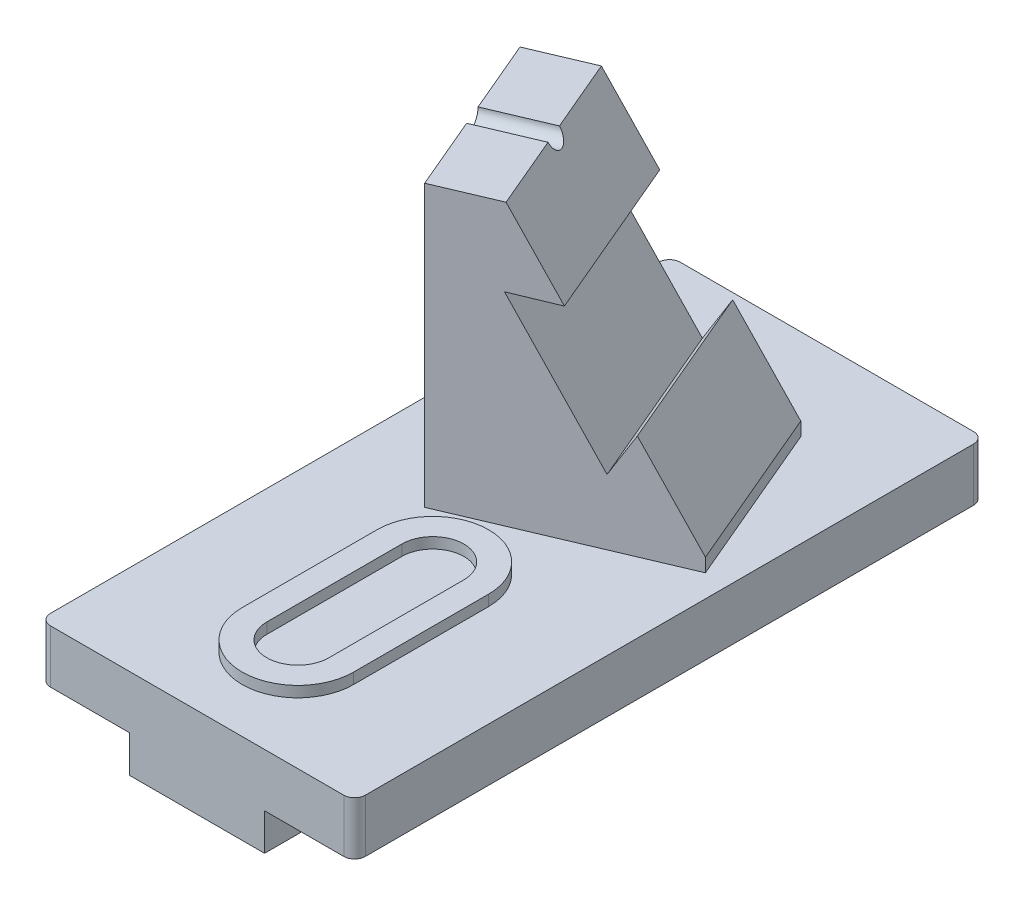
ISO-10303-21;
HEADER;
FILE_DESCRIPTION(('STEP AP214'),'2;1');
FILE_NAME('part.step','',(''),(''),'','','');
FILE_SCHEMA(('AUTOMOTIVE_DESIGN { 1 0 10303 214 1 1 1 1 }'));
ENDSEC;
DATA;
#1=APPLICATION_CONTEXT('core data for automotive mechanical design processes');
#2=APPLICATION_PROTOCOL_DEFINITION('international standard','automotive_design',2000,#1);
#3=PRODUCT_CONTEXT('',#1,'mechanical');
#4=PRODUCT('Part','Part','',(#3));
#5=PRODUCT_RELATED_PRODUCT_CATEGORY('part','',(#4));
#6=PRODUCT_DEFINITION_FORMATION('','',#4);
#7=PRODUCT_DEFINITION_CONTEXT('part definition',#1,'design');
#8=PRODUCT_DEFINITION('design','',#6,#7);
#9=PRODUCT_DEFINITION_SHAPE('','',#8);
#10=(LENGTH_UNIT() NAMED_UNIT(*) SI_UNIT(.MILLI.,.METRE.));
#11=(NAMED_UNIT(*) PLANE_ANGLE_UNIT() SI_UNIT($,.RADIAN.));
#12=(NAMED_UNIT(*) SI_UNIT($,.STERADIAN.) SOLID_ANGLE_UNIT());
#13=UNCERTAINTY_MEASURE_WITH_UNIT(LENGTH_MEASURE(1.E-05),#10,'distance_accuracy_value','');
#14=(GEOMETRIC_REPRESENTATION_CONTEXT(3) GLOBAL_UNCERTAINTY_ASSIGNED_CONTEXT((#13)) GLOBAL_UNIT_ASSIGNED_CONTEXT((#10,
#11,#12)) REPRESENTATION_CONTEXT('',''));
#15=CARTESIAN_POINT('',(0.,0.,0.));
#16=DIRECTION('',(0.,0.,1.));
#17=DIRECTION('',(1.,0.,0.));
#18=AXIS2_PLACEMENT_3D('',#15,#16,#17);
#19=CARTESIAN_POINT('',(-147.226380819536,312.,193.89303788996));
#20=DIRECTION('',(0.,-1.,0.));
#21=DIRECTION('',(1.,0.,0.));
#22=AXIS2_PLACEMENT_3D('',#19,#20,#21);
#23=PLANE('',#22);
#24=DIRECTION('',(0.92050485345244,0.,-0.390731128489275));
#25=VECTOR('',#24,1.);
#26=CARTESIAN_POINT('',(-1191.60011822053,312.,758.87575039678));
#27=LINE('',#26,#25);
#28=CARTESIAN_POINT('',(-103.464494428737,312.000000000001,296.989581476633));
#29=VERTEX_POINT('',#28);
#30=CARTESIAN_POINT('',(-39.9496595405185,312.,270.029133610873));
#31=VERTEX_POINT('',#30);
#32=EDGE_CURVE('E48',#29,#31,#27,.T.);
#33=ORIENTED_EDGE('',*,*,#32,.F.);
#34=DIRECTION('',(0.390731128489275,0.,0.92050485345244));
#35=VECTOR('',#34,1.);
#36=CARTESIAN_POINT('',(-147.226380819536,312.,193.89303788996));
#37=LINE('',#36,#35);
#38=CARTESIAN_POINT('',(-69.0801551216807,312.,377.994008580448));
#39=VERTEX_POINT('',#38);
#40=EDGE_CURVE('E245',#29,#39,#37,.T.);
#41=ORIENTED_EDGE('',*,*,#40,.T.);
#42=DIRECTION('',(0.92050485345244,0.,-0.390731128489275));
#43=VECTOR('',#42,1.);
#44=CARTESIAN_POINT('',(-69.0801551216807,312.,377.994008580448));
#45=LINE('',#44,#43);
#46=CARTESIAN_POINT('',(-5.56532023346235,312.,351.033560714688));
#47=VERTEX_POINT('',#46);
#48=EDGE_CURVE('E287',#39,#47,#45,.T.);
#49=ORIENTED_EDGE('',*,*,#48,.T.);
#50=DIRECTION('',(0.390731128489275,0.,0.92050485345244));
#51=VECTOR('',#50,1.);
#52=CARTESIAN_POINT('',(-83.7115459313173,312.,166.9325900242));
#53=LINE('',#52,#51);
#54=EDGE_CURVE('E246',#31,#47,#53,.T.);
#55=ORIENTED_EDGE('',*,*,#54,.F.);
#56=EDGE_LOOP('',(#33,#41,#49,#55));
#57=FACE_BOUND('',#56,.T.);
#58=ADVANCED_FACE('F33',(#57),#23,.F.);
#59=CARTESIAN_POINT('',(-175.,0.,700.));
#60=DIRECTION('',(0.,-1.,0.));
#61=DIRECTION('',(0.,0.,-1.));
#62=AXIS2_PLACEMENT_3D('',#59,#60,#61);
#63=PLANE('',#62);
#64=DIRECTION('',(0.390731128489275,0.,0.92050485345244));
#65=VECTOR('',#64,1.);
#66=CARTESIAN_POINT('',(-147.226380819536,0.,193.89303788996));
#67=LINE('',#66,#65);
#68=CARTESIAN_POINT('',(-147.226380819536,0.,193.89303788996));
#69=VERTEX_POINT('',#68);
#70=CARTESIAN_POINT('',(-69.0801551216807,0.,377.994008580448));
#71=VERTEX_POINT('',#70);
#72=EDGE_CURVE('E314',#69,#71,#67,.T.);
#73=ORIENTED_EDGE('',*,*,#72,.F.);
#74=DIRECTION('',(-0.92050485345244,0.,0.390731128489275));
#75=VECTOR('',#74,1.);
#76=CARTESIAN_POINT('',(71.853774302145,0.,100.899029309512));
#77=LINE('',#76,#75);
#78=CARTESIAN_POINT('',(71.853774302145,0.,100.899029309512));
#79=VERTEX_POINT('',#78);
#80=EDGE_CURVE('E262',#79,#69,#77,.T.);
#81=ORIENTED_EDGE('',*,*,#80,.F.);
#82=DIRECTION('',(0.390731128489275,0.,0.92050485345244));
#83=VECTOR('',#82,1.);
#84=CARTESIAN_POINT('',(71.853774302145,0.,100.899029309512));
#85=LINE('',#84,#83);
#86=CARTESIAN_POINT('',(150.,0.,285.));
#87=VERTEX_POINT('',#86);
#88=EDGE_CURVE('E317',#79,#87,#85,.T.);
#89=ORIENTED_EDGE('',*,*,#88,.T.);
#90=DIRECTION('',(-0.92050485345244,0.,0.390731128489275));
#91=VECTOR('',#90,1.);
#92=CARTESIAN_POINT('',(150.,0.,285.));
#93=LINE('',#92,#91);
#94=EDGE_CURVE('E282',#87,#71,#93,.T.);
#95=ORIENTED_EDGE('',*,*,#94,.T.);
#96=EDGE_LOOP('',(#73,#81,#89,#95));
#97=FACE_BOUND('',#96,.T.);
#98=DIRECTION('',(-1.,0.,0.));
#99=VECTOR('',#98,1.);
#100=CARTESIAN_POINT('',(-175.,0.,0.));
#101=LINE('',#100,#99);
#102=CARTESIAN_POINT('',(163.,0.,0.));
#103=VERTEX_POINT('',#102);
#104=CARTESIAN_POINT('',(-163.,0.,0.));
#105=VERTEX_POINT('',#104);
#106=EDGE_CURVE('E386',#103,#105,#101,.T.);
#107=ORIENTED_EDGE('',*,*,#106,.T.);
#108=CARTESIAN_POINT('',(-163.,0.,12.));
#109=DIRECTION('',(0.,-1.,0.));
#110=DIRECTION('',(0.,0.,-1.));
#111=AXIS2_PLACEMENT_3D('',#108,#109,#110);
#112=CIRCLE('',#111,12.);
#113=CARTESIAN_POINT('',(-175.,0.,12.));
#114=VERTEX_POINT('',#113);
#115=EDGE_CURVE('E453',#105,#114,#112,.F.);
#116=ORIENTED_EDGE('',*,*,#115,.T.);
#117=DIRECTION('',(0.,0.,-1.));
#118=VECTOR('',#117,1.);
#119=CARTESIAN_POINT('',(-175.,0.,700.));
#120=LINE('',#119,#118);
#121=CARTESIAN_POINT('',(-175.,0.,688.));
#122=VERTEX_POINT('',#121);
#123=EDGE_CURVE('E398',#122,#114,#120,.T.);
#124=ORIENTED_EDGE('',*,*,#123,.F.);
#125=CARTESIAN_POINT('',(-163.,0.,688.));
#126=DIRECTION('',(0.,-1.,0.));
#127=DIRECTION('',(0.,0.,-1.));
#128=AXIS2_PLACEMENT_3D('',#125,#126,#127);
#129=CIRCLE('',#128,12.);
#130=CARTESIAN_POINT('',(-163.,0.,700.));
#131=VERTEX_POINT('',#130);
#132=EDGE_CURVE('E447',#122,#131,#129,.F.);
#133=ORIENTED_EDGE('',*,*,#132,.T.);
#134=DIRECTION('',(-1.,0.,0.));
#135=VECTOR('',#134,1.);
#136=CARTESIAN_POINT('',(-175.,0.,700.));
#137=LINE('',#136,#135);
#138=CARTESIAN_POINT('',(163.,0.,700.));
#139=VERTEX_POINT('',#138);
#140=EDGE_CURVE('E395',#139,#131,#137,.T.);
#141=ORIENTED_EDGE('',*,*,#140,.F.);
#142=CARTESIAN_POINT('',(163.,0.,688.));
#143=DIRECTION('',(0.,-1.,0.));
#144=DIRECTION('',(0.,0.,-1.));
#145=AXIS2_PLACEMENT_3D('',#142,#143,#144);
#146=CIRCLE('',#145,12.);
#147=CARTESIAN_POINT('',(175.,0.,688.));
#148=VERTEX_POINT('',#147);
#149=EDGE_CURVE('E449',#139,#148,#146,.F.);
#150=ORIENTED_EDGE('',*,*,#149,.T.);
#151=DIRECTION('',(0.,0.,-1.));
#152=VECTOR('',#151,1.);
#153=CARTESIAN_POINT('',(175.,0.,700.));
#154=LINE('',#153,#152);
#155=CARTESIAN_POINT('',(175.,0.,12.));
#156=VERTEX_POINT('',#155);
#157=EDGE_CURVE('E413',#148,#156,#154,.T.);
#158=ORIENTED_EDGE('',*,*,#157,.T.);
#159=CARTESIAN_POINT('',(163.,0.,12.));
#160=DIRECTION('',(0.,-1.,0.));
#161=DIRECTION('',(0.,0.,-1.));
#162=AXIS2_PLACEMENT_3D('',#159,#160,#161);
#163=CIRCLE('',#162,12.);
#164=EDGE_CURVE('E451',#156,#103,#163,.F.);
#165=ORIENTED_EDGE('',*,*,#164,.T.);
#166=EDGE_LOOP('',(#107,#116,#124,#133,#141,#150,#158,#165));
#167=FACE_BOUND('',#166,.T.);
#168=CARTESIAN_POINT('',(-1.54344196692571E-13,0.,588.));
#169=DIRECTION('',(0.,1.,0.));
#170=DIRECTION('',(0.,0.,1.));
#171=AXIS2_PLACEMENT_3D('',#168,#169,#170);
#172=CIRCLE('',#171,62.);
#173=CARTESIAN_POINT('',(-62.0000000000001,0.,588.));
#174=VERTEX_POINT('',#173);
#175=CARTESIAN_POINT('',(61.9999999999998,0.,588.));
#176=VERTEX_POINT('',#175);
#177=EDGE_CURVE('E349',#174,#176,#172,.T.);
#178=ORIENTED_EDGE('',*,*,#177,.F.);
#179=DIRECTION('',(0.,0.,1.));
#180=VECTOR('',#179,1.);
#181=CARTESIAN_POINT('',(-62.0000000000001,0.,588.));
#182=LINE('',#181,#180);
#183=CARTESIAN_POINT('',(-62.0000000000001,0.,438.));
#184=VERTEX_POINT('',#183);
#185=EDGE_CURVE('E354',#184,#174,#182,.T.);
#186=ORIENTED_EDGE('',*,*,#185,.F.);
#187=CARTESIAN_POINT('',(1.1760479271815E-13,0.,438.));
#188=DIRECTION('',(0.,1.,0.));
#189=DIRECTION('',(0.,0.,1.));
#190=AXIS2_PLACEMENT_3D('',#187,#188,#189);
#191=CIRCLE('',#190,62.0000000000001);
#192=CARTESIAN_POINT('',(62.0000000000002,0.,438.));
#193=VERTEX_POINT('',#192);
#194=EDGE_CURVE('E366',#193,#184,#191,.T.);
#195=ORIENTED_EDGE('',*,*,#194,.F.);
#196=DIRECTION('',(0.,0.,-1.));
#197=VECTOR('',#196,1.);
#198=CARTESIAN_POINT('',(61.9999999999998,0.,588.));
#199=LINE('',#198,#197);
#200=EDGE_CURVE('E363',#176,#193,#199,.T.);
#201=ORIENTED_EDGE('',*,*,#200,.F.);
#202=EDGE_LOOP('',(#178,#186,#195,#201));
#203=FACE_BOUND('',#202,.T.);
#204=ADVANCED_FACE('F476',(#97,#167,#203),#63,.F.);
#205=CARTESIAN_POINT('',(-175.,-59.,700.));
#206=DIRECTION('',(1.,0.,0.));
#207=DIRECTION('',(0.,0.,-1.));
#208=AXIS2_PLACEMENT_3D('',#205,#206,#207);
#209=PLANE('',#208);
#210=ORIENTED_EDGE('',*,*,#123,.T.);
#211=DIRECTION('',(0.,-1.,0.));
#212=VECTOR('',#211,1.);
#213=CARTESIAN_POINT('',(-175.,-59.,12.));
#214=LINE('',#213,#212);
#215=CARTESIAN_POINT('',(-175.,-59.,12.));
#216=VERTEX_POINT('',#215);
#217=EDGE_CURVE('E436',#114,#216,#214,.T.);
#218=ORIENTED_EDGE('',*,*,#217,.T.);
#219=DIRECTION('',(0.,0.,-1.));
#220=VECTOR('',#219,1.);
#221=CARTESIAN_POINT('',(-175.,-59.,700.));
#222=LINE('',#221,#220);
#223=CARTESIAN_POINT('',(-175.,-59.,688.));
#224=VERTEX_POINT('',#223);
#225=EDGE_CURVE('E431',#224,#216,#222,.T.);
#226=ORIENTED_EDGE('',*,*,#225,.F.);
#227=DIRECTION('',(0.,-1.,0.));
#228=VECTOR('',#227,1.);
#229=CARTESIAN_POINT('',(-175.,-59.,688.));
#230=LINE('',#229,#228);
#231=EDGE_CURVE('E434',#224,#122,#230,.F.);
#232=ORIENTED_EDGE('',*,*,#231,.T.);
#233=EDGE_LOOP('',(#210,#218,#226,#232));
#234=FACE_BOUND('',#233,.T.);
#235=ADVANCED_FACE('F526',(#234),#209,.F.);
#236=CARTESIAN_POINT('',(-75.,-59.,700.));
#237=DIRECTION('',(0.,1.,0.));
#238=DIRECTION('',(-1.,0.,0.));
#239=AXIS2_PLACEMENT_3D('',#236,#237,#238);
#240=PLANE('',#239);
#241=ORIENTED_EDGE('',*,*,#225,.T.);
#242=CARTESIAN_POINT('',(-163.,-59.,12.));
#243=DIRECTION('',(0.,1.,0.));
#244=DIRECTION('',(-1.,0.,0.));
#245=AXIS2_PLACEMENT_3D('',#242,#243,#244);
#246=CIRCLE('',#245,12.);
#247=CARTESIAN_POINT('',(-163.,-59.,0.));
#248=VERTEX_POINT('',#247);
#249=EDGE_CURVE('E441',#216,#248,#246,.F.);
#250=ORIENTED_EDGE('',*,*,#249,.T.);
#251=DIRECTION('',(1.,0.,0.));
#252=VECTOR('',#251,1.);
#253=CARTESIAN_POINT('',(-75.,-59.,0.));
#254=LINE('',#253,#252);
#255=CARTESIAN_POINT('',(-75.,-59.,0.));
#256=VERTEX_POINT('',#255);
#257=EDGE_CURVE('E382',#248,#256,#254,.T.);
#258=ORIENTED_EDGE('',*,*,#257,.T.);
#259=DIRECTION('',(0.,0.,-1.));
#260=VECTOR('',#259,1.);
#261=CARTESIAN_POINT('',(-75.,-59.,700.));
#262=LINE('',#261,#260);
#263=CARTESIAN_POINT('',(-75.,-59.,700.));
#264=VERTEX_POINT('',#263);
#265=EDGE_CURVE('E428',#264,#256,#262,.T.);
#266=ORIENTED_EDGE('',*,*,#265,.F.);
#267=DIRECTION('',(1.,0.,0.));
#268=VECTOR('',#267,1.);
#269=CARTESIAN_POINT('',(-75.,-59.,700.));
#270=LINE('',#269,#268);
#271=CARTESIAN_POINT('',(-163.,-59.,700.));
#272=VERTEX_POINT('',#271);
#273=EDGE_CURVE('E383',#272,#264,#270,.T.);
#274=ORIENTED_EDGE('',*,*,#273,.F.);
#275=CARTESIAN_POINT('',(-163.,-59.,688.));
#276=DIRECTION('',(0.,1.,0.));
#277=DIRECTION('',(-1.,0.,0.));
#278=AXIS2_PLACEMENT_3D('',#275,#276,#277);
#279=CIRCLE('',#278,12.);
#280=EDGE_CURVE('E439',#272,#224,#279,.F.);
#281=ORIENTED_EDGE('',*,*,#280,.T.);
#282=EDGE_LOOP('',(#241,#250,#258,#266,#274,#281));
#283=FACE_BOUND('',#282,.T.);
#284=ADVANCED_FACE('F486',(#283),#240,.F.);
#285=CARTESIAN_POINT('',(-75.,-100.,700.));
#286=DIRECTION('',(1.,0.,0.));
#287=DIRECTION('',(0.,0.,-1.));
#288=AXIS2_PLACEMENT_3D('',#285,#286,#287);
#289=PLANE('',#288);
#290=DIRECTION('',(0.,-1.,0.));
#291=VECTOR('',#290,1.);
#292=CARTESIAN_POINT('',(-75.,-100.,0.));
#293=LINE('',#292,#291);
#294=CARTESIAN_POINT('',(-75.,-100.,0.));
#295=VERTEX_POINT('',#294);
#296=EDGE_CURVE('E400',#256,#295,#293,.T.);
#297=ORIENTED_EDGE('',*,*,#296,.T.);
#298=DIRECTION('',(0.,0.,-1.));
#299=VECTOR('',#298,1.);
#300=CARTESIAN_POINT('',(-75.,-100.,700.));
#301=LINE('',#300,#299);
#302=CARTESIAN_POINT('',(-75.,-100.,700.));
#303=VERTEX_POINT('',#302);
#304=EDGE_CURVE('E425',#303,#295,#301,.T.);
#305=ORIENTED_EDGE('',*,*,#304,.F.);
#306=DIRECTION('',(0.,-1.,0.));
#307=VECTOR('',#306,1.);
#308=CARTESIAN_POINT('',(-75.,-100.,700.));
#309=LINE('',#308,#307);
#310=EDGE_CURVE('E385',#264,#303,#309,.T.);
#311=ORIENTED_EDGE('',*,*,#310,.F.);
#312=ORIENTED_EDGE('',*,*,#265,.T.);
#313=EDGE_LOOP('',(#297,#305,#311,#312));
#314=FACE_BOUND('',#313,.T.);
#315=ADVANCED_FACE('F493',(#314),#289,.F.);
#316=CARTESIAN_POINT('',(75.,-100.,700.));
#317=DIRECTION('',(0.,1.,0.));
#318=DIRECTION('',(0.,0.,1.));
#319=AXIS2_PLACEMENT_3D('',#316,#317,#318);
#320=PLANE('',#319);
#321=DIRECTION('',(1.,0.,0.));
#322=VECTOR('',#321,1.);
#323=CARTESIAN_POINT('',(75.,-100.,0.));
#324=LINE('',#323,#322);
#325=CARTESIAN_POINT('',(75.,-100.,0.));
#326=VERTEX_POINT('',#325);
#327=EDGE_CURVE('E402',#295,#326,#324,.T.);
#328=ORIENTED_EDGE('',*,*,#327,.T.);
#329=DIRECTION('',(0.,0.,-1.));
#330=VECTOR('',#329,1.);
#331=CARTESIAN_POINT('',(75.,-100.,700.));
#332=LINE('',#331,#330);
#333=CARTESIAN_POINT('',(75.,-100.,700.));
#334=VERTEX_POINT('',#333);
#335=EDGE_CURVE('E422',#334,#326,#332,.T.);
#336=ORIENTED_EDGE('',*,*,#335,.F.);
#337=DIRECTION('',(1.,0.,0.));
#338=VECTOR('',#337,1.);
#339=CARTESIAN_POINT('',(75.,-100.,700.));
#340=LINE('',#339,#338);
#341=EDGE_CURVE('E388',#303,#334,#340,.T.);
#342=ORIENTED_EDGE('',*,*,#341,.F.);
#343=ORIENTED_EDGE('',*,*,#304,.T.);
#344=EDGE_LOOP('',(#328,#336,#342,#343));
#345=FACE_BOUND('',#344,.T.);
#346=ADVANCED_FACE('F499',(#345),#320,.F.);
#347=CARTESIAN_POINT('',(75.,-59.,700.));
#348=DIRECTION('',(-1.,0.,0.));
#349=DIRECTION('',(0.,0.,1.));
#350=AXIS2_PLACEMENT_3D('',#347,#348,#349);
#351=PLANE('',#350);
#352=DIRECTION('',(0.,1.,0.));
#353=VECTOR('',#352,1.);
#354=CARTESIAN_POINT('',(75.,-59.,0.));
#355=LINE('',#354,#353);
#356=CARTESIAN_POINT('',(75.,-59.,0.));
#357=VERTEX_POINT('',#356);
#358=EDGE_CURVE('E404',#326,#357,#355,.T.);
#359=ORIENTED_EDGE('',*,*,#358,.T.);
#360=DIRECTION('',(0.,0.,-1.));
#361=VECTOR('',#360,1.);
#362=CARTESIAN_POINT('',(75.,-59.,700.));
#363=LINE('',#362,#361);
#364=CARTESIAN_POINT('',(75.,-59.,700.));
#365=VERTEX_POINT('',#364);
#366=EDGE_CURVE('E419',#365,#357,#363,.T.);
#367=ORIENTED_EDGE('',*,*,#366,.F.);
#368=DIRECTION('',(0.,1.,0.));
#369=VECTOR('',#368,1.);
#370=CARTESIAN_POINT('',(75.,-59.,700.));
#371=LINE('',#370,#369);
#372=EDGE_CURVE('E390',#334,#365,#371,.T.);
#373=ORIENTED_EDGE('',*,*,#372,.F.);
#374=ORIENTED_EDGE('',*,*,#335,.T.);
#375=EDGE_LOOP('',(#359,#367,#373,#374));
#376=FACE_BOUND('',#375,.T.);
#377=ADVANCED_FACE('F503',(#376),#351,.F.);
#378=CARTESIAN_POINT('',(175.,-59.,700.));
#379=DIRECTION('',(0.,1.,0.));
#380=DIRECTION('',(-1.,0.,0.));
#381=AXIS2_PLACEMENT_3D('',#378,#379,#380);
#382=PLANE('',#381);
#383=DIRECTION('',(1.,0.,0.));
#384=VECTOR('',#383,1.);
#385=CARTESIAN_POINT('',(175.,-59.,0.));
#386=LINE('',#385,#384);
#387=CARTESIAN_POINT('',(163.,-59.,0.));
#388=VERTEX_POINT('',#387);
#389=EDGE_CURVE('E406',#357,#388,#386,.T.);
#390=ORIENTED_EDGE('',*,*,#389,.T.);
#391=CARTESIAN_POINT('',(163.,-59.,12.));
#392=DIRECTION('',(0.,1.,0.));
#393=DIRECTION('',(-1.,0.,0.));
#394=AXIS2_PLACEMENT_3D('',#391,#392,#393);
#395=CIRCLE('',#394,12.);
#396=CARTESIAN_POINT('',(175.,-59.,12.));
#397=VERTEX_POINT('',#396);
#398=EDGE_CURVE('E462',#388,#397,#395,.F.);
#399=ORIENTED_EDGE('',*,*,#398,.T.);
#400=DIRECTION('',(0.,0.,-1.));
#401=VECTOR('',#400,1.);
#402=CARTESIAN_POINT('',(175.,-59.,700.));
#403=LINE('',#402,#401);
#404=CARTESIAN_POINT('',(175.,-59.,688.));
#405=VERTEX_POINT('',#404);
#406=EDGE_CURVE('E416',#405,#397,#403,.T.);
#407=ORIENTED_EDGE('',*,*,#406,.F.);
#408=CARTESIAN_POINT('',(163.,-59.,688.));
#409=DIRECTION('',(0.,1.,0.));
#410=DIRECTION('',(-1.,0.,0.));
#411=AXIS2_PLACEMENT_3D('',#408,#409,#410);
#412=CIRCLE('',#411,12.);
#413=CARTESIAN_POINT('',(163.,-59.,700.));
#414=VERTEX_POINT('',#413);
#415=EDGE_CURVE('E460',#405,#414,#412,.F.);
#416=ORIENTED_EDGE('',*,*,#415,.T.);
#417=DIRECTION('',(1.,0.,0.));
#418=VECTOR('',#417,1.);
#419=CARTESIAN_POINT('',(175.,-59.,700.));
#420=LINE('',#419,#418);
#421=EDGE_CURVE('E392',#365,#414,#420,.T.);
#422=ORIENTED_EDGE('',*,*,#421,.F.);
#423=ORIENTED_EDGE('',*,*,#366,.T.);
#424=EDGE_LOOP('',(#390,#399,#407,#416,#422,#423));
#425=FACE_BOUND('',#424,.T.);
#426=ADVANCED_FACE('F506',(#425),#382,.F.);
#427=CARTESIAN_POINT('',(175.,0.,700.));
#428=DIRECTION('',(-1.,0.,0.));
#429=DIRECTION('',(0.,0.,1.));
#430=AXIS2_PLACEMENT_3D('',#427,#428,#429);
#431=PLANE('',#430);
#432=ORIENTED_EDGE('',*,*,#406,.T.);
#433=DIRECTION('',(0.,1.,0.));
#434=VECTOR('',#433,1.);
#435=CARTESIAN_POINT('',(175.,0.,12.));
#436=LINE('',#435,#434);
#437=EDGE_CURVE('E457',#397,#156,#436,.T.);
#438=ORIENTED_EDGE('',*,*,#437,.T.);
#439=ORIENTED_EDGE('',*,*,#157,.F.);
#440=DIRECTION('',(0.,1.,0.));
#441=VECTOR('',#440,1.);
#442=CARTESIAN_POINT('',(175.,0.,688.));
#443=LINE('',#442,#441);
#444=EDGE_CURVE('E455',#148,#405,#443,.F.);
#445=ORIENTED_EDGE('',*,*,#444,.T.);
#446=EDGE_LOOP('',(#432,#438,#439,#445));
#447=FACE_BOUND('',#446,.T.);
#448=ADVANCED_FACE('F511',(#447),#431,.F.);
#449=CARTESIAN_POINT('',(0.,0.,700.));
#450=DIRECTION('',(0.,0.,-1.));
#451=DIRECTION('',(-1.,0.,0.));
#452=AXIS2_PLACEMENT_3D('',#449,#450,#451);
#453=PLANE('',#452);
#454=ORIENTED_EDGE('',*,*,#421,.T.);
#455=DIRECTION('',(0.,1.,0.));
#456=VECTOR('',#455,1.);
#457=CARTESIAN_POINT('',(163.,0.,700.));
#458=LINE('',#457,#456);
#459=EDGE_CURVE('E41',#414,#139,#458,.T.);
#460=ORIENTED_EDGE('',*,*,#459,.T.);
#461=ORIENTED_EDGE('',*,*,#140,.T.);
#462=DIRECTION('',(0.,-1.,0.));
#463=VECTOR('',#462,1.);
#464=CARTESIAN_POINT('',(-163.,0.,700.));
#465=LINE('',#464,#463);
#466=EDGE_CURVE('E464',#131,#272,#465,.T.);
#467=ORIENTED_EDGE('',*,*,#466,.T.);
#468=ORIENTED_EDGE('',*,*,#273,.T.);
#469=ORIENTED_EDGE('',*,*,#310,.T.);
#470=ORIENTED_EDGE('',*,*,#341,.T.);
#471=ORIENTED_EDGE('',*,*,#372,.T.);
#472=EDGE_LOOP('',(#454,#460,#461,#467,#468,#469,#470,#471));
#473=FACE_BOUND('',#472,.T.);
#474=ADVANCED_FACE('F470',(#473),#453,.F.);
#475=CARTESIAN_POINT('',(0.,0.,0.));
#476=DIRECTION('',(0.,0.,-1.));
#477=DIRECTION('',(-1.,0.,0.));
#478=AXIS2_PLACEMENT_3D('',#475,#476,#477);
#479=PLANE('',#478);
#480=ORIENTED_EDGE('',*,*,#257,.F.);
#481=DIRECTION('',(0.,-1.,0.));
#482=VECTOR('',#481,1.);
#483=CARTESIAN_POINT('',(-163.,0.,0.));
#484=LINE('',#483,#482);
#485=EDGE_CURVE('E445',#248,#105,#484,.F.);
#486=ORIENTED_EDGE('',*,*,#485,.T.);
#487=ORIENTED_EDGE('',*,*,#106,.F.);
#488=DIRECTION('',(0.,1.,0.));
#489=VECTOR('',#488,1.);
#490=CARTESIAN_POINT('',(163.,-59.,0.));
#491=LINE('',#490,#489);
#492=EDGE_CURVE('E443',#103,#388,#491,.F.);
#493=ORIENTED_EDGE('',*,*,#492,.T.);
#494=ORIENTED_EDGE('',*,*,#389,.F.);
#495=ORIENTED_EDGE('',*,*,#358,.F.);
#496=ORIENTED_EDGE('',*,*,#327,.F.);
#497=ORIENTED_EDGE('',*,*,#296,.F.);
#498=EDGE_LOOP('',(#480,#486,#487,#493,#494,#495,#496,#497));
#499=FACE_BOUND('',#498,.T.);
#500=ADVANCED_FACE('F518',(#499),#479,.T.);
#501=CARTESIAN_POINT('',(-163.,-59.,12.));
#502=DIRECTION('',(0.,1.,0.));
#503=DIRECTION('',(0.,0.,1.));
#504=AXIS2_PLACEMENT_3D('',#501,#502,#503);
#505=CYLINDRICAL_SURFACE('',#504,12.);
#506=ORIENTED_EDGE('',*,*,#115,.F.);
#507=ORIENTED_EDGE('',*,*,#485,.F.);
#508=ORIENTED_EDGE('',*,*,#249,.F.);
#509=ORIENTED_EDGE('',*,*,#217,.F.);
#510=EDGE_LOOP('',(#506,#507,#508,#509));
#511=FACE_BOUND('',#510,.T.);
#512=ADVANCED_FACE('F523',(#511),#505,.T.);
#513=CARTESIAN_POINT('',(163.,0.,12.));
#514=DIRECTION('',(0.,-1.,0.));
#515=DIRECTION('',(0.,0.,-1.));
#516=AXIS2_PLACEMENT_3D('',#513,#514,#515);
#517=CYLINDRICAL_SURFACE('',#516,12.);
#518=ORIENTED_EDGE('',*,*,#398,.F.);
#519=ORIENTED_EDGE('',*,*,#492,.F.);
#520=ORIENTED_EDGE('',*,*,#164,.F.);
#521=ORIENTED_EDGE('',*,*,#437,.F.);
#522=EDGE_LOOP('',(#518,#519,#520,#521));
#523=FACE_BOUND('',#522,.T.);
#524=ADVANCED_FACE('F521',(#523),#517,.T.);
#525=CARTESIAN_POINT('',(163.,0.,688.));
#526=DIRECTION('',(0.,1.,0.));
#527=DIRECTION('',(0.,0.,1.));
#528=AXIS2_PLACEMENT_3D('',#525,#526,#527);
#529=CYLINDRICAL_SURFACE('',#528,12.);
#530=ORIENTED_EDGE('',*,*,#415,.F.);
#531=ORIENTED_EDGE('',*,*,#444,.F.);
#532=ORIENTED_EDGE('',*,*,#149,.F.);
#533=ORIENTED_EDGE('',*,*,#459,.F.);
#534=EDGE_LOOP('',(#530,#531,#532,#533));
#535=FACE_BOUND('',#534,.T.);
#536=ADVANCED_FACE('F509',(#535),#529,.T.);
#537=CARTESIAN_POINT('',(-163.,0.,688.));
#538=DIRECTION('',(0.,-1.,0.));
#539=DIRECTION('',(0.,0.,-1.));
#540=AXIS2_PLACEMENT_3D('',#537,#538,#539);
#541=CYLINDRICAL_SURFACE('',#540,12.);
#542=ORIENTED_EDGE('',*,*,#132,.F.);
#543=ORIENTED_EDGE('',*,*,#231,.F.);
#544=ORIENTED_EDGE('',*,*,#280,.F.);
#545=ORIENTED_EDGE('',*,*,#466,.F.);
#546=EDGE_LOOP('',(#542,#543,#544,#545));
#547=FACE_BOUND('',#546,.T.);
#548=ADVANCED_FACE('F35',(#547),#541,.T.);
#549=CARTESIAN_POINT('',(-1.54344196692571E-13,12.,588.));
#550=DIRECTION('',(0.,1.,0.));
#551=DIRECTION('',(0.,0.,1.));
#552=AXIS2_PLACEMENT_3D('',#549,#550,#551);
#553=PLANE('',#552);
#554=CARTESIAN_POINT('',(-1.54344196692571E-13,12.,588.));
#555=DIRECTION('',(0.,1.,0.));
#556=DIRECTION('',(0.,0.,1.));
#557=AXIS2_PLACEMENT_3D('',#554,#555,#556);
#558=CIRCLE('',#557,62.);
#559=CARTESIAN_POINT('',(-62.0000000000001,12.,588.));
#560=VERTEX_POINT('',#559);
#561=CARTESIAN_POINT('',(61.9999999999998,12.,588.));
#562=VERTEX_POINT('',#561);
#563=EDGE_CURVE('E350',#560,#562,#558,.T.);
#564=ORIENTED_EDGE('',*,*,#563,.T.);
#565=DIRECTION('',(0.,0.,-1.));
#566=VECTOR('',#565,1.);
#567=CARTESIAN_POINT('',(61.9999999999998,12.,588.));
#568=LINE('',#567,#566);
#569=CARTESIAN_POINT('',(62.0000000000002,12.,438.));
#570=VERTEX_POINT('',#569);
#571=EDGE_CURVE('E353',#562,#570,#568,.T.);
#572=ORIENTED_EDGE('',*,*,#571,.T.);
#573=CARTESIAN_POINT('',(1.1760479271815E-13,12.,438.));
#574=DIRECTION('',(0.,1.,0.));
#575=DIRECTION('',(0.,0.,1.));
#576=AXIS2_PLACEMENT_3D('',#573,#574,#575);
#577=CIRCLE('',#576,62.0000000000001);
#578=CARTESIAN_POINT('',(-62.0000000000001,12.,438.));
#579=VERTEX_POINT('',#578);
#580=EDGE_CURVE('E356',#570,#579,#577,.T.);
#581=ORIENTED_EDGE('',*,*,#580,.T.);
#582=DIRECTION('',(0.,0.,1.));
#583=VECTOR('',#582,1.);
#584=CARTESIAN_POINT('',(-62.0000000000001,12.,588.));
#585=LINE('',#584,#583);
#586=EDGE_CURVE('E358',#579,#560,#585,.T.);
#587=ORIENTED_EDGE('',*,*,#586,.T.);
#588=EDGE_LOOP('',(#564,#572,#581,#587));
#589=FACE_BOUND('',#588,.T.);
#590=DIRECTION('',(0.,0.,-1.));
#591=VECTOR('',#590,1.);
#592=CARTESIAN_POINT('',(34.5000000000003,12.,588.));
#593=LINE('',#592,#591);
#594=CARTESIAN_POINT('',(34.5000000000003,12.,588.));
#595=VERTEX_POINT('',#594);
#596=CARTESIAN_POINT('',(34.5000000000003,12.,438.));
#597=VERTEX_POINT('',#596);
#598=EDGE_CURVE('E322',#595,#597,#593,.T.);
#599=ORIENTED_EDGE('',*,*,#598,.F.);
#600=CARTESIAN_POINT('',(-1.54344196692571E-13,12.,588.));
#601=DIRECTION('',(0.,1.,0.));
#602=DIRECTION('',(0.,0.,1.));
#603=AXIS2_PLACEMENT_3D('',#600,#601,#602);
#604=CIRCLE('',#603,34.5000000000002);
#605=CARTESIAN_POINT('',(-34.5000000000002,12.,588.));
#606=VERTEX_POINT('',#605);
#607=EDGE_CURVE('E320',#606,#595,#604,.T.);
#608=ORIENTED_EDGE('',*,*,#607,.F.);
#609=DIRECTION('',(0.,0.,1.));
#610=VECTOR('',#609,1.);
#611=CARTESIAN_POINT('',(-34.5000000000002,12.,588.));
#612=LINE('',#611,#610);
#613=CARTESIAN_POINT('',(-34.5000000000001,12.,438.));
#614=VERTEX_POINT('',#613);
#615=EDGE_CURVE('E328',#614,#606,#612,.T.);
#616=ORIENTED_EDGE('',*,*,#615,.F.);
#617=CARTESIAN_POINT('',(1.1760479271815E-13,12.,438.));
#618=DIRECTION('',(0.,1.,0.));
#619=DIRECTION('',(0.,0.,1.));
#620=AXIS2_PLACEMENT_3D('',#617,#618,#619);
#621=CIRCLE('',#620,34.5000000000001);
#622=EDGE_CURVE('E325',#597,#614,#621,.T.);
#623=ORIENTED_EDGE('',*,*,#622,.F.);
#624=EDGE_LOOP('',(#599,#608,#616,#623));
#625=FACE_BOUND('',#624,.T.);
#626=ADVANCED_FACE('F575',(#589,#625),#553,.T.);
#627=CARTESIAN_POINT('',(-1.54344196692571E-13,12.,588.));
#628=DIRECTION('',(0.,-1.,0.));
#629=DIRECTION('',(0.,0.,-1.));
#630=AXIS2_PLACEMENT_3D('',#627,#628,#629);
#631=CYLINDRICAL_SURFACE('',#630,62.);
#632=ORIENTED_EDGE('',*,*,#177,.T.);
#633=DIRECTION('',(0.,-1.,0.));
#634=VECTOR('',#633,1.);
#635=CARTESIAN_POINT('',(61.9999999999998,12.,588.));
#636=LINE('',#635,#634);
#637=EDGE_CURVE('E379',#562,#176,#636,.T.);
#638=ORIENTED_EDGE('',*,*,#637,.F.);
#639=ORIENTED_EDGE('',*,*,#563,.F.);
#640=DIRECTION('',(0.,-1.,0.));
#641=VECTOR('',#640,1.);
#642=CARTESIAN_POINT('',(-62.0000000000001,12.,588.));
#643=LINE('',#642,#641);
#644=EDGE_CURVE('E360',#560,#174,#643,.T.);
#645=ORIENTED_EDGE('',*,*,#644,.T.);
#646=EDGE_LOOP('',(#632,#638,#639,#645));
#647=FACE_BOUND('',#646,.T.);
#648=ADVANCED_FACE('F578',(#647),#631,.T.);
#649=CARTESIAN_POINT('',(61.9999999999998,12.,588.));
#650=DIRECTION('',(-1.,0.,0.));
#651=DIRECTION('',(0.,0.,1.));
#652=AXIS2_PLACEMENT_3D('',#649,#650,#651);
#653=PLANE('',#652);
#654=ORIENTED_EDGE('',*,*,#200,.T.);
#655=DIRECTION('',(0.,-1.,0.));
#656=VECTOR('',#655,1.);
#657=CARTESIAN_POINT('',(62.0000000000002,12.,438.));
#658=LINE('',#657,#656);
#659=EDGE_CURVE('E376',#570,#193,#658,.T.);
#660=ORIENTED_EDGE('',*,*,#659,.F.);
#661=ORIENTED_EDGE('',*,*,#571,.F.);
#662=ORIENTED_EDGE('',*,*,#637,.T.);
#663=EDGE_LOOP('',(#654,#660,#661,#662));
#664=FACE_BOUND('',#663,.T.);
#665=ADVANCED_FACE('F586',(#664),#653,.F.);
#666=CARTESIAN_POINT('',(1.1760479271815E-13,12.,438.));
#667=DIRECTION('',(0.,-1.,0.));
#668=DIRECTION('',(0.,0.,-1.));
#669=AXIS2_PLACEMENT_3D('',#666,#667,#668);
#670=CYLINDRICAL_SURFACE('',#669,62.0000000000001);
#671=ORIENTED_EDGE('',*,*,#194,.T.);
#672=DIRECTION('',(0.,-1.,0.));
#673=VECTOR('',#672,1.);
#674=CARTESIAN_POINT('',(-62.0000000000001,12.,438.));
#675=LINE('',#674,#673);
#676=EDGE_CURVE('E373',#579,#184,#675,.T.);
#677=ORIENTED_EDGE('',*,*,#676,.F.);
#678=ORIENTED_EDGE('',*,*,#580,.F.);
#679=ORIENTED_EDGE('',*,*,#659,.T.);
#680=EDGE_LOOP('',(#671,#677,#678,#679));
#681=FACE_BOUND('',#680,.T.);
#682=ADVANCED_FACE('F582',(#681),#670,.T.);
#683=CARTESIAN_POINT('',(-62.0000000000001,12.,588.));
#684=DIRECTION('',(1.,0.,0.));
#685=DIRECTION('',(0.,0.,-1.));
#686=AXIS2_PLACEMENT_3D('',#683,#684,#685);
#687=PLANE('',#686);
#688=ORIENTED_EDGE('',*,*,#185,.T.);
#689=ORIENTED_EDGE('',*,*,#644,.F.);
#690=ORIENTED_EDGE('',*,*,#586,.F.);
#691=ORIENTED_EDGE('',*,*,#676,.T.);
#692=EDGE_LOOP('',(#688,#689,#690,#691));
#693=FACE_BOUND('',#692,.T.);
#694=ADVANCED_FACE('F573',(#693),#687,.F.);
#695=CARTESIAN_POINT('',(-1.54344196692571E-13,12.,588.));
#696=DIRECTION('',(0.,-1.,0.));
#697=DIRECTION('',(0.,0.,-1.));
#698=AXIS2_PLACEMENT_3D('',#695,#696,#697);
#699=CYLINDRICAL_SURFACE('',#698,34.5000000000002);
#700=CARTESIAN_POINT('',(-1.54344196692571E-13,0.,588.));
#701=DIRECTION('',(0.,1.,0.));
#702=DIRECTION('',(0.,0.,1.));
#703=AXIS2_PLACEMENT_3D('',#700,#701,#702);
#704=CIRCLE('',#703,34.5000000000002);
#705=CARTESIAN_POINT('',(-34.5000000000002,0.,588.));
#706=VERTEX_POINT('',#705);
#707=CARTESIAN_POINT('',(34.5000000000003,0.,588.));
#708=VERTEX_POINT('',#707);
#709=EDGE_CURVE('E319',#706,#708,#704,.T.);
#710=ORIENTED_EDGE('',*,*,#709,.F.);
#711=DIRECTION('',(0.,-1.,0.));
#712=VECTOR('',#711,1.);
#713=CARTESIAN_POINT('',(-34.5000000000002,12.,588.));
#714=LINE('',#713,#712);
#715=EDGE_CURVE('E330',#606,#706,#714,.T.);
#716=ORIENTED_EDGE('',*,*,#715,.F.);
#717=ORIENTED_EDGE('',*,*,#607,.T.);
#718=DIRECTION('',(0.,-1.,0.));
#719=VECTOR('',#718,1.);
#720=CARTESIAN_POINT('',(34.5000000000003,12.,588.));
#721=LINE('',#720,#719);
#722=EDGE_CURVE('E346',#595,#708,#721,.T.);
#723=ORIENTED_EDGE('',*,*,#722,.T.);
#724=EDGE_LOOP('',(#710,#716,#717,#723));
#725=FACE_BOUND('',#724,.T.);
#726=ADVANCED_FACE('F569',(#725),#699,.F.);
#727=CARTESIAN_POINT('',(34.5000000000003,12.,588.));
#728=DIRECTION('',(-1.,0.,0.));
#729=DIRECTION('',(0.,0.,1.));
#730=AXIS2_PLACEMENT_3D('',#727,#728,#729);
#731=PLANE('',#730);
#732=DIRECTION('',(0.,0.,-1.));
#733=VECTOR('',#732,1.);
#734=CARTESIAN_POINT('',(34.5000000000003,0.,588.));
#735=LINE('',#734,#733);
#736=CARTESIAN_POINT('',(34.5000000000003,0.,438.));
#737=VERTEX_POINT('',#736);
#738=EDGE_CURVE('E333',#708,#737,#735,.T.);
#739=ORIENTED_EDGE('',*,*,#738,.F.);
#740=ORIENTED_EDGE('',*,*,#722,.F.);
#741=ORIENTED_EDGE('',*,*,#598,.T.);
#742=DIRECTION('',(0.,-1.,0.));
#743=VECTOR('',#742,1.);
#744=CARTESIAN_POINT('',(34.5000000000003,12.,438.));
#745=LINE('',#744,#743);
#746=EDGE_CURVE('E344',#597,#737,#745,.T.);
#747=ORIENTED_EDGE('',*,*,#746,.T.);
#748=EDGE_LOOP('',(#739,#740,#741,#747));
#749=FACE_BOUND('',#748,.T.);
#750=ADVANCED_FACE('F565',(#749),#731,.T.);
#751=CARTESIAN_POINT('',(1.1760479271815E-13,12.,438.));
#752=DIRECTION('',(0.,-1.,0.));
#753=DIRECTION('',(0.,0.,-1.));
#754=AXIS2_PLACEMENT_3D('',#751,#752,#753);
#755=CYLINDRICAL_SURFACE('',#754,34.5000000000001);
#756=CARTESIAN_POINT('',(1.1760479271815E-13,0.,438.));
#757=DIRECTION('',(0.,1.,0.));
#758=DIRECTION('',(0.,0.,1.));
#759=AXIS2_PLACEMENT_3D('',#756,#757,#758);
#760=CIRCLE('',#759,34.5000000000001);
#761=CARTESIAN_POINT('',(-34.5000000000001,0.,438.));
#762=VERTEX_POINT('',#761);
#763=EDGE_CURVE('E336',#737,#762,#760,.T.);
#764=ORIENTED_EDGE('',*,*,#763,.F.);
#765=ORIENTED_EDGE('',*,*,#746,.F.);
#766=ORIENTED_EDGE('',*,*,#622,.T.);
#767=DIRECTION('',(0.,-1.,0.));
#768=VECTOR('',#767,1.);
#769=CARTESIAN_POINT('',(-34.5000000000001,12.,438.));
#770=LINE('',#769,#768);
#771=EDGE_CURVE('E342',#614,#762,#770,.T.);
#772=ORIENTED_EDGE('',*,*,#771,.T.);
#773=EDGE_LOOP('',(#764,#765,#766,#772));
#774=FACE_BOUND('',#773,.T.);
#775=ADVANCED_FACE('F561',(#774),#755,.F.);
#776=CARTESIAN_POINT('',(-34.5000000000002,12.,588.));
#777=DIRECTION('',(1.,0.,0.));
#778=DIRECTION('',(0.,0.,-1.));
#779=AXIS2_PLACEMENT_3D('',#776,#777,#778);
#780=PLANE('',#779);
#781=DIRECTION('',(0.,0.,1.));
#782=VECTOR('',#781,1.);
#783=CARTESIAN_POINT('',(-34.5000000000002,0.,588.));
#784=LINE('',#783,#782);
#785=EDGE_CURVE('E323',#762,#706,#784,.T.);
#786=ORIENTED_EDGE('',*,*,#785,.F.);
#787=ORIENTED_EDGE('',*,*,#771,.F.);
#788=ORIENTED_EDGE('',*,*,#615,.T.);
#789=ORIENTED_EDGE('',*,*,#715,.T.);
#790=EDGE_LOOP('',(#786,#787,#788,#789));
#791=FACE_BOUND('',#790,.T.);
#792=ADVANCED_FACE('F558',(#791),#780,.T.);
#793=ORIENTED_EDGE('',*,*,#785,.T.);
#794=ORIENTED_EDGE('',*,*,#709,.T.);
#795=ORIENTED_EDGE('',*,*,#738,.T.);
#796=ORIENTED_EDGE('',*,*,#763,.T.);
#797=EDGE_LOOP('',(#793,#794,#795,#796));
#798=FACE_BOUND('',#797,.T.);
#799=ADVANCED_FACE('F536',(#798),#63,.F.);
#800=CARTESIAN_POINT('',(71.853774302145,0.,100.899029309512));
#801=DIRECTION('',(-0.92050485345244,0.,0.390731128489275));
#802=DIRECTION('',(0.390731128489275,0.,0.92050485345244));
#803=AXIS2_PLACEMENT_3D('',#800,#801,#802);
#804=PLANE('',#803);
#805=DIRECTION('',(0.,-1.,0.));
#806=VECTOR('',#805,1.);
#807=CARTESIAN_POINT('',(150.,0.,285.));
#808=LINE('',#807,#806);
#809=CARTESIAN_POINT('',(150.,15.,285.));
#810=VERTEX_POINT('',#809);
#811=EDGE_CURVE('E256',#810,#87,#808,.T.);
#812=ORIENTED_EDGE('',*,*,#811,.T.);
#813=ORIENTED_EDGE('',*,*,#88,.F.);
#814=DIRECTION('',(0.,-1.,0.));
#815=VECTOR('',#814,1.);
#816=CARTESIAN_POINT('',(71.853774302145,0.,100.899029309512));
#817=LINE('',#816,#815);
#818=CARTESIAN_POINT('',(71.853774302145,15.,100.899029309512));
#819=VERTEX_POINT('',#818);
#820=EDGE_CURVE('E259',#819,#79,#817,.T.);
#821=ORIENTED_EDGE('',*,*,#820,.F.);
#822=DIRECTION('',(0.390731128489275,0.,0.92050485345244));
#823=VECTOR('',#822,1.);
#824=CARTESIAN_POINT('',(71.853774302145,15.,100.899029309512));
#825=LINE('',#824,#823);
#826=EDGE_CURVE('E279',#819,#810,#825,.T.);
#827=ORIENTED_EDGE('',*,*,#826,.T.);
#828=EDGE_LOOP('',(#812,#813,#821,#827));
#829=FACE_BOUND('',#828,.T.);
#830=ADVANCED_FACE('F551',(#829),#804,.F.);
#831=CARTESIAN_POINT('',(-147.226380819536,0.,193.89303788996));
#832=DIRECTION('',(0.92050485345244,0.,-0.390731128489275));
#833=DIRECTION('',(-0.390731128489275,0.,-0.92050485345244));
#834=AXIS2_PLACEMENT_3D('',#831,#832,#833);
#835=PLANE('',#834);
#836=CARTESIAN_POINT('',(-108.153267970608,312.,285.943523235204));
#837=DIRECTION('',(0.92050485345244,0.,-0.390731128489275));
#838=DIRECTION('',(-0.390731128489275,0.,-0.92050485345244));
#839=AXIS2_PLACEMENT_3D('',#836,#837,#838);
#840=CIRCLE('',#839,12.);
#841=CARTESIAN_POINT('',(-112.842041512479,312.000000000001,274.897464993774));
#842=VERTEX_POINT('',#841);
#843=EDGE_CURVE('E55',#842,#29,#840,.F.);
#844=ORIENTED_EDGE('',*,*,#843,.F.);
#845=CARTESIAN_POINT('',(-147.226380819536,312.,193.89303788996));
#846=VERTEX_POINT('',#845);
#847=EDGE_CURVE('E251',#846,#842,#37,.T.);
#848=ORIENTED_EDGE('',*,*,#847,.F.);
#849=DIRECTION('',(0.,1.,0.));
#850=VECTOR('',#849,1.);
#851=CARTESIAN_POINT('',(-147.226380819536,0.,193.89303788996));
#852=LINE('',#851,#850);
#853=EDGE_CURVE('E266',#69,#846,#852,.T.);
#854=ORIENTED_EDGE('',*,*,#853,.F.);
#855=ORIENTED_EDGE('',*,*,#72,.T.);
#856=DIRECTION('',(0.,1.,0.));
#857=VECTOR('',#856,1.);
#858=CARTESIAN_POINT('',(-69.0801551216807,0.,377.994008580448));
#859=LINE('',#858,#857);
#860=EDGE_CURVE('E284',#71,#39,#859,.T.);
#861=ORIENTED_EDGE('',*,*,#860,.T.);
#862=ORIENTED_EDGE('',*,*,#40,.F.);
#863=EDGE_LOOP('',(#844,#848,#854,#855,#861,#862));
#864=FACE_BOUND('',#863,.T.);
#865=ADVANCED_FACE('F545',(#864),#835,.F.);
#866=ORIENTED_EDGE('',*,*,#847,.T.);
#867=DIRECTION('',(0.92050485345244,0.,-0.390731128489275));
#868=VECTOR('',#867,1.);
#869=CARTESIAN_POINT('',(-1200.97766530427,312.,736.783633913922));
#870=LINE('',#869,#868);
#871=CARTESIAN_POINT('',(-49.3272066242609,312.,247.937017128014));
#872=VERTEX_POINT('',#871);
#873=EDGE_CURVE('E249',#842,#872,#870,.T.);
#874=ORIENTED_EDGE('',*,*,#873,.T.);
#875=CARTESIAN_POINT('',(-83.7115459313173,312.,166.9325900242));
#876=VERTEX_POINT('',#875);
#877=EDGE_CURVE('E238',#876,#872,#53,.T.);
#878=ORIENTED_EDGE('',*,*,#877,.F.);
#879=DIRECTION('',(0.92050485345244,0.,-0.390731128489275));
#880=VECTOR('',#879,1.);
#881=CARTESIAN_POINT('',(-147.226380819536,312.,193.89303788996));
#882=LINE('',#881,#880);
#883=EDGE_CURVE('E268',#846,#876,#882,.T.);
#884=ORIENTED_EDGE('',*,*,#883,.F.);
#885=EDGE_LOOP('',(#866,#874,#878,#884));
#886=FACE_BOUND('',#885,.T.);
#887=ADVANCED_FACE('F250',(#886),#23,.F.);
#888=CARTESIAN_POINT('',(-83.7115459313173,312.,166.9325900242));
#889=DIRECTION('',(-0.800049562243476,-0.49456236498491,0.339600890891875));
#890=DIRECTION('',(0.525811537525645,-0.850601097462798,0.));
#891=AXIS2_PLACEMENT_3D('',#888,#889,#890);
#892=PLANE('',#891);
#893=CARTESIAN_POINT('',(-44.6384330823897,312.,258.983075369444));
#894=DIRECTION('',(-0.800049562243476,-0.49456236498491,0.339600890891875));
#895=DIRECTION('',(0.455247057303527,-0.869142144381765,-0.193240910978879));
#896=AXIS2_PLACEMENT_3D('',#893,#894,#895);
#897=ELLIPSE('',#896,13.8067174369226,12.);
#898=EDGE_CURVE('E11',#31,#872,#897,.F.);
#899=ORIENTED_EDGE('',*,*,#898,.F.);
#900=ORIENTED_EDGE('',*,*,#54,.T.);
#901=DIRECTION('',(0.455247057303527,-0.869142144381765,-0.193240910978879));
#902=VECTOR('',#901,1.);
#903=CARTESIAN_POINT('',(-5.56532023346235,312.,351.033560714688));
#904=LINE('',#903,#902);
#905=CARTESIAN_POINT('',(39.9593854968903,225.085785561823,331.7094696168));
#906=VERTEX_POINT('',#905);
#907=EDGE_CURVE('E290',#47,#906,#904,.T.);
#908=ORIENTED_EDGE('',*,*,#907,.T.);
#909=DIRECTION('',(0.390731128489275,0.,0.92050485345244));
#910=VECTOR('',#909,1.);
#911=CARTESIAN_POINT('',(-38.1868402009647,225.085785561823,147.608498926312));
#912=LINE('',#911,#910);
#913=CARTESIAN_POINT('',(-38.1868402009647,225.085785561823,147.608498926312));
#914=VERTEX_POINT('',#913);
#915=EDGE_CURVE('E310',#914,#906,#912,.T.);
#916=ORIENTED_EDGE('',*,*,#915,.F.);
#917=DIRECTION('',(0.455247057303527,-0.869142144381765,-0.193240910978879));
#918=VECTOR('',#917,1.);
#919=CARTESIAN_POINT('',(-83.7115459313173,312.,166.9325900242));
#920=LINE('',#919,#918);
#921=EDGE_CURVE('E242',#876,#914,#920,.T.);
#922=ORIENTED_EDGE('',*,*,#921,.F.);
#923=ORIENTED_EDGE('',*,*,#877,.T.);
#924=EDGE_LOOP('',(#899,#900,#908,#916,#922,#923));
#925=FACE_BOUND('',#924,.T.);
#926=ADVANCED_FACE('F240',(#925),#892,.F.);
#927=CARTESIAN_POINT('',(-84.9538494272844,225.404217347493,167.459916572327));
#928=DIRECTION('',(0.0057692644987711,0.999980359026746,-0.00244890748778047));
#929=DIRECTION('',(-0.99998335755528,0.0057692817984151,0.));
#930=AXIS2_PLACEMENT_3D('',#927,#928,#929);
#931=PLANE('',#930);
#932=DIRECTION('',(-0.920486773841233,0.00626750035823595,0.390723454149631));
#933=VECTOR('',#932,1.);
#934=CARTESIAN_POINT('',(-6.80762372942945,225.404217347493,351.560887262815));
#935=LINE('',#934,#933);
#936=CARTESIAN_POINT('',(-6.80762372942945,225.404217347493,351.560887262815));
#937=VERTEX_POINT('',#936);
#938=EDGE_CURVE('E292',#906,#937,#935,.T.);
#939=ORIENTED_EDGE('',*,*,#938,.T.);
#940=DIRECTION('',(0.390731128489275,0.,0.92050485345244));
#941=VECTOR('',#940,1.);
#942=CARTESIAN_POINT('',(-84.9538494272844,225.404217347493,167.459916572327));
#943=LINE('',#942,#941);
#944=CARTESIAN_POINT('',(-84.9538494272844,225.404217347493,167.459916572327));
#945=VERTEX_POINT('',#944);
#946=EDGE_CURVE('E307',#945,#937,#943,.T.);
#947=ORIENTED_EDGE('',*,*,#946,.F.);
#948=DIRECTION('',(-0.920486773841233,0.00626750035823595,0.390723454149631));
#949=VECTOR('',#948,1.);
#950=CARTESIAN_POINT('',(-84.9538494272844,225.404217347493,167.459916572327));
#951=LINE('',#950,#949);
#952=EDGE_CURVE('E271',#914,#945,#951,.T.);
#953=ORIENTED_EDGE('',*,*,#952,.F.);
#954=ORIENTED_EDGE('',*,*,#915,.T.);
#955=EDGE_LOOP('',(#939,#947,#953,#954));
#956=FACE_BOUND('',#955,.T.);
#957=ADVANCED_FACE('F550',(#956),#931,.F.);
#958=CARTESIAN_POINT('',(-4.9183102891297,72.6030976097607,133.486845806422));
#959=DIRECTION('',(-0.800049562243476,-0.49456236498491,0.339600890891875));
#960=DIRECTION('',(0.525811537525645,-0.850601097462798,0.));
#961=AXIS2_PLACEMENT_3D('',#958,#959,#960);
#962=PLANE('',#961);
#963=DIRECTION('',(0.455247057303526,-0.869142144381765,-0.193240910978879));
#964=VECTOR('',#963,1.);
#965=CARTESIAN_POINT('',(73.2279154087253,72.6030976097607,317.58781649691));
#966=LINE('',#965,#964);
#967=CARTESIAN_POINT('',(73.2279154087253,72.6030976097607,317.58781649691));
#968=VERTEX_POINT('',#967);
#969=EDGE_CURVE('E294',#937,#968,#966,.T.);
#970=ORIENTED_EDGE('',*,*,#969,.T.);
#971=DIRECTION('',(0.390731128489275,0.,0.92050485345244));
#972=VECTOR('',#971,1.);
#973=CARTESIAN_POINT('',(-4.9183102891297,72.6030976097607,133.486845806422));
#974=LINE('',#973,#972);
#975=CARTESIAN_POINT('',(-4.9183102891297,72.6030976097607,133.486845806422));
#976=VERTEX_POINT('',#975);
#977=EDGE_CURVE('E304',#976,#968,#974,.T.);
#978=ORIENTED_EDGE('',*,*,#977,.F.);
#979=DIRECTION('',(0.455247057303526,-0.869142144381765,-0.193240910978879));
#980=VECTOR('',#979,1.);
#981=CARTESIAN_POINT('',(-4.9183102891297,72.6030976097607,133.486845806422));
#982=LINE('',#981,#980);
#983=EDGE_CURVE('E273',#945,#976,#982,.T.);
#984=ORIENTED_EDGE('',*,*,#983,.F.);
#985=ORIENTED_EDGE('',*,*,#946,.T.);
#986=EDGE_LOOP('',(#970,#978,#984,#985));
#987=FACE_BOUND('',#986,.T.);
#988=ADVANCED_FACE('F715',(#987),#962,.F.);
#989=CARTESIAN_POINT('',(18.7190419619762,116.443017514103,123.453385053952));
#990=DIRECTION('',(0.794280297744704,-0.505417994041832,-0.337151983404095));
#991=DIRECTION('',(0.536850463941359,0.843677414279858,0.));
#992=AXIS2_PLACEMENT_3D('',#989,#990,#991);
#993=PLANE('',#992);
#994=DIRECTION('',(0.465239716537702,0.862874644023529,-0.197482543170751));
#995=VECTOR('',#994,1.);
#996=CARTESIAN_POINT('',(96.8652676598311,116.443017514103,307.55435574444));
#997=LINE('',#996,#995);
#998=CARTESIAN_POINT('',(96.8652676598311,116.443017514103,307.55435574444));
#999=VERTEX_POINT('',#998);
#1000=EDGE_CURVE('E296',#968,#999,#997,.T.);
#1001=ORIENTED_EDGE('',*,*,#1000,.T.);
#1002=DIRECTION('',(0.390731128489275,0.,0.92050485345244));
#1003=VECTOR('',#1002,1.);
#1004=CARTESIAN_POINT('',(18.7190419619762,116.443017514103,123.453385053952));
#1005=LINE('',#1004,#1003);
#1006=CARTESIAN_POINT('',(18.7190419619762,116.443017514103,123.453385053952));
#1007=VERTEX_POINT('',#1006);
#1008=EDGE_CURVE('E301',#1007,#999,#1005,.T.);
#1009=ORIENTED_EDGE('',*,*,#1008,.F.);
#1010=DIRECTION('',(0.465239716537702,0.862874644023529,-0.197482543170751));
#1011=VECTOR('',#1010,1.);
#1012=CARTESIAN_POINT('',(18.7190419619762,116.443017514103,123.453385053952));
#1013=LINE('',#1012,#1011);
#1014=EDGE_CURVE('E275',#976,#1007,#1013,.T.);
#1015=ORIENTED_EDGE('',*,*,#1014,.F.);
#1016=ORIENTED_EDGE('',*,*,#977,.T.);
#1017=EDGE_LOOP('',(#1001,#1009,#1015,#1016));
#1018=FACE_BOUND('',#1017,.T.);
#1019=ADVANCED_FACE('F726',(#1018),#993,.F.);
#1020=CARTESIAN_POINT('',(71.853774302145,15.,100.899029309512));
#1021=DIRECTION('',(-0.800049562243476,-0.49456236498491,0.339600890891875));
#1022=DIRECTION('',(0.525811537525646,-0.850601097462798,0.));
#1023=AXIS2_PLACEMENT_3D('',#1020,#1021,#1022);
#1024=PLANE('',#1023);
#1025=DIRECTION('',(0.455247057303527,-0.869142144381765,-0.193240910978879));
#1026=VECTOR('',#1025,1.);
#1027=CARTESIAN_POINT('',(150.,15.,285.));
#1028=LINE('',#1027,#1026);
#1029=EDGE_CURVE('E263',#999,#810,#1028,.T.);
#1030=ORIENTED_EDGE('',*,*,#1029,.T.);
#1031=ORIENTED_EDGE('',*,*,#826,.F.);
#1032=DIRECTION('',(0.455247057303527,-0.869142144381765,-0.193240910978879));
#1033=VECTOR('',#1032,1.);
#1034=CARTESIAN_POINT('',(71.853774302145,15.,100.899029309512));
#1035=LINE('',#1034,#1033);
#1036=EDGE_CURVE('E277',#1007,#819,#1035,.T.);
#1037=ORIENTED_EDGE('',*,*,#1036,.F.);
#1038=ORIENTED_EDGE('',*,*,#1008,.T.);
#1039=EDGE_LOOP('',(#1030,#1031,#1037,#1038));
#1040=FACE_BOUND('',#1039,.T.);
#1041=ADVANCED_FACE('F736',(#1040),#1024,.F.);
#1042=CARTESIAN_POINT('',(47.2603180659784,0.,111.338332125318));
#1043=DIRECTION('',(-0.390731128489275,0.,-0.92050485345244));
#1044=DIRECTION('',(-0.92050485345244,0.,0.390731128489275));
#1045=AXIS2_PLACEMENT_3D('',#1042,#1043,#1044);
#1046=PLANE('',#1045);
#1047=ORIENTED_EDGE('',*,*,#820,.T.);
#1048=ORIENTED_EDGE('',*,*,#80,.T.);
#1049=ORIENTED_EDGE('',*,*,#853,.T.);
#1050=ORIENTED_EDGE('',*,*,#883,.T.);
#1051=ORIENTED_EDGE('',*,*,#921,.T.);
#1052=ORIENTED_EDGE('',*,*,#952,.T.);
#1053=ORIENTED_EDGE('',*,*,#983,.T.);
#1054=ORIENTED_EDGE('',*,*,#1014,.T.);
#1055=ORIENTED_EDGE('',*,*,#1036,.T.);
#1056=EDGE_LOOP('',(#1047,#1048,#1049,#1050,#1051,#1052,#1053,#1054,#1055));
#1057=FACE_BOUND('',#1056,.T.);
#1058=ADVANCED_FACE('F746',(#1057),#1046,.T.);
#1059=CARTESIAN_POINT('',(125.406543763833,0.,295.439302815806));
#1060=DIRECTION('',(-0.390731128489275,0.,-0.92050485345244));
#1061=DIRECTION('',(-0.92050485345244,0.,0.390731128489275));
#1062=AXIS2_PLACEMENT_3D('',#1059,#1060,#1061);
#1063=PLANE('',#1062);
#1064=ORIENTED_EDGE('',*,*,#811,.F.);
#1065=ORIENTED_EDGE('',*,*,#1029,.F.);
#1066=ORIENTED_EDGE('',*,*,#1000,.F.);
#1067=ORIENTED_EDGE('',*,*,#969,.F.);
#1068=ORIENTED_EDGE('',*,*,#938,.F.);
#1069=ORIENTED_EDGE('',*,*,#907,.F.);
#1070=ORIENTED_EDGE('',*,*,#48,.F.);
#1071=ORIENTED_EDGE('',*,*,#860,.F.);
#1072=ORIENTED_EDGE('',*,*,#94,.F.);
#1073=EDGE_LOOP('',(#1064,#1065,#1066,#1067,#1068,#1069,#1070,#1071,#1072));
#1074=FACE_BOUND('',#1073,.T.);
#1075=ADVANCED_FACE('F756',(#1074),#1063,.F.);
#1076=CARTESIAN_POINT('',(-1196.2888917624,312.,747.829692155351));
#1077=DIRECTION('',(0.92050485345244,0.,-0.390731128489275));
#1078=DIRECTION('',(-0.390731128489275,0.,-0.92050485345244));
#1079=AXIS2_PLACEMENT_3D('',#1076,#1077,#1078);
#1080=CYLINDRICAL_SURFACE('',#1079,12.);
#1081=ORIENTED_EDGE('',*,*,#873,.F.);
#1082=ORIENTED_EDGE('',*,*,#843,.T.);
#1083=ORIENTED_EDGE('',*,*,#32,.T.);
#1084=ORIENTED_EDGE('',*,*,#898,.T.);
#1085=EDGE_LOOP('',(#1081,#1082,#1083,#1084));
#1086=FACE_BOUND('',#1085,.T.);
#1087=ADVANCED_FACE('F254',(#1086),#1080,.F.);
#1088=CLOSED_SHELL('',(#58,#204,#235,#284,#315,#346,#377,#426,#448,#474,#500,#512,#524,#536,
#548,#626,#648,#665,#682,#694,#726,#750,#775,#792,#799,#830,#865,#887,#926,#957,#988,#1019,
#1041,#1058,#1075,#1087));
#1089=MANIFOLD_SOLID_BREP('B2',#1088);
#1090=ADVANCED_BREP_SHAPE_REPRESENTATION('',(#18,#1089),#14);
#1091=SHAPE_DEFINITION_REPRESENTATION(#9,#1090);
ENDSEC;
END-ISO-10303-21;
